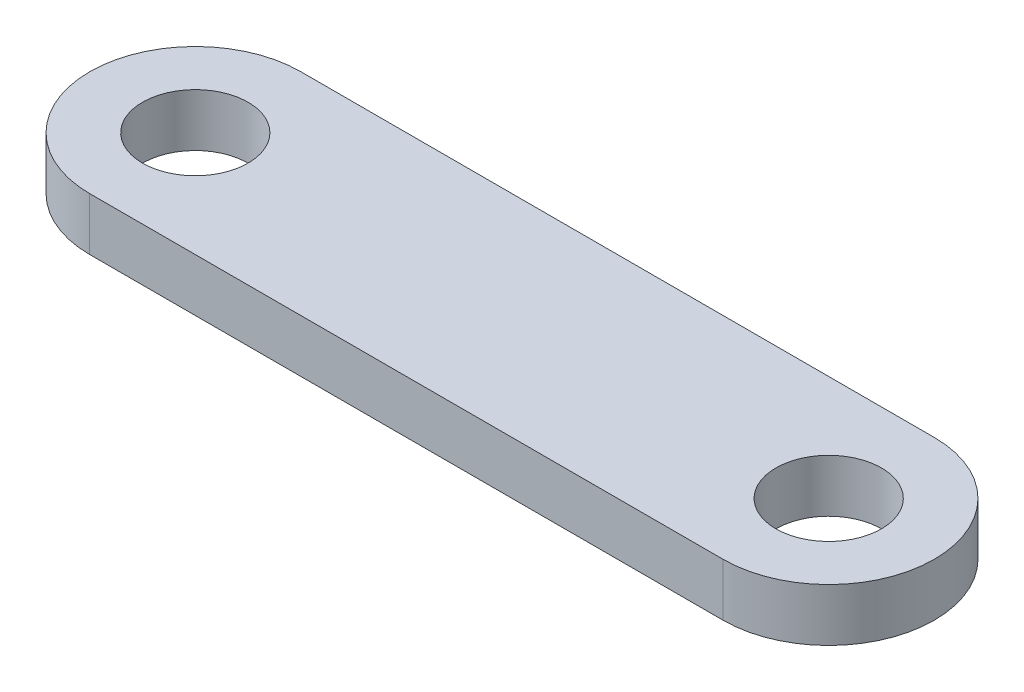
ISO-10303-21;
HEADER;
FILE_DESCRIPTION(('STEP AP214'),'2;1');
FILE_NAME('part.step','',(''),(''),'','','');
FILE_SCHEMA(('AUTOMOTIVE_DESIGN { 1 0 10303 214 1 1 1 1 }'));
ENDSEC;
DATA;
#1=APPLICATION_CONTEXT('core data for automotive mechanical design processes');
#2=APPLICATION_PROTOCOL_DEFINITION('international standard','automotive_design',2000,#1);
#3=PRODUCT_CONTEXT('',#1,'mechanical');
#4=PRODUCT('Part','Part','',(#3));
#5=PRODUCT_RELATED_PRODUCT_CATEGORY('part','',(#4));
#6=PRODUCT_DEFINITION_FORMATION('','',#4);
#7=PRODUCT_DEFINITION_CONTEXT('part definition',#1,'design');
#8=PRODUCT_DEFINITION('design','',#6,#7);
#9=PRODUCT_DEFINITION_SHAPE('','',#8);
#10=(LENGTH_UNIT() NAMED_UNIT(*) SI_UNIT(.MILLI.,.METRE.));
#11=(NAMED_UNIT(*) PLANE_ANGLE_UNIT() SI_UNIT($,.RADIAN.));
#12=(NAMED_UNIT(*) SI_UNIT($,.STERADIAN.) SOLID_ANGLE_UNIT());
#13=UNCERTAINTY_MEASURE_WITH_UNIT(LENGTH_MEASURE(1.E-05),#10,'distance_accuracy_value','');
#14=(GEOMETRIC_REPRESENTATION_CONTEXT(3) GLOBAL_UNCERTAINTY_ASSIGNED_CONTEXT((#13)) GLOBAL_UNIT_ASSIGNED_CONTEXT((#10,
#11,#12)) REPRESENTATION_CONTEXT('',''));
#15=CARTESIAN_POINT('',(0.,0.,0.));
#16=DIRECTION('',(0.,0.,1.));
#17=DIRECTION('',(1.,0.,0.));
#18=AXIS2_PLACEMENT_3D('',#15,#16,#17);
#19=CARTESIAN_POINT('',(-72.3468097091892,5.,0.));
#20=DIRECTION('',(0.,1.,0.));
#21=DIRECTION('',(0.,0.,1.));
#22=AXIS2_PLACEMENT_3D('',#19,#20,#21);
#23=PLANE('',#22);
#24=CARTESIAN_POINT('',(-72.3468097091892,5.,0.));
#25=DIRECTION('',(0.,1.,0.));
#26=DIRECTION('',(0.,0.,1.));
#27=AXIS2_PLACEMENT_3D('',#24,#25,#26);
#28=CIRCLE('',#27,5.);
#29=CARTESIAN_POINT('',(-72.3468097091892,5.,5.));
#30=VERTEX_POINT('',#29);
#31=EDGE_CURVE('E116',#30,#30,#28,.T.);
#32=ORIENTED_EDGE('',*,*,#31,.F.);
#33=EDGE_LOOP('',(#32));
#34=FACE_BOUND('',#33,.T.);
#35=CARTESIAN_POINT('',(-72.3468097091892,5.,0.));
#36=DIRECTION('',(0.,1.,0.));
#37=DIRECTION('',(0.,0.,1.));
#38=AXIS2_PLACEMENT_3D('',#35,#36,#37);
#39=CIRCLE('',#38,10.);
#40=CARTESIAN_POINT('',(-72.3468097091892,5.,-10.));
#41=VERTEX_POINT('',#40);
#42=CARTESIAN_POINT('',(-72.3468097091892,5.,10.));
#43=VERTEX_POINT('',#42);
#44=EDGE_CURVE('E96',#41,#43,#39,.T.);
#45=ORIENTED_EDGE('',*,*,#44,.T.);
#46=DIRECTION('',(1.,0.,0.));
#47=VECTOR('',#46,1.);
#48=CARTESIAN_POINT('',(-72.3468097091892,5.,10.));
#49=LINE('',#48,#47);
#50=CARTESIAN_POINT('',(-12.3468097091892,5.,10.));
#51=VERTEX_POINT('',#50);
#52=EDGE_CURVE('E91',#43,#51,#49,.T.);
#53=ORIENTED_EDGE('',*,*,#52,.T.);
#54=CARTESIAN_POINT('',(-12.3468097091892,5.,0.));
#55=DIRECTION('',(0.,1.,0.));
#56=DIRECTION('',(0.,0.,1.));
#57=AXIS2_PLACEMENT_3D('',#54,#55,#56);
#58=CIRCLE('',#57,10.);
#59=CARTESIAN_POINT('',(-12.3468097091892,5.,-10.));
#60=VERTEX_POINT('',#59);
#61=EDGE_CURVE('E94',#51,#60,#58,.T.);
#62=ORIENTED_EDGE('',*,*,#61,.T.);
#63=DIRECTION('',(-1.,0.,0.));
#64=VECTOR('',#63,1.);
#65=CARTESIAN_POINT('',(-72.3468097091892,5.,-10.));
#66=LINE('',#65,#64);
#67=EDGE_CURVE('E61',#60,#41,#66,.T.);
#68=ORIENTED_EDGE('',*,*,#67,.T.);
#69=EDGE_LOOP('',(#45,#53,#62,#68));
#70=FACE_BOUND('',#69,.T.);
#71=CARTESIAN_POINT('',(-12.3468097091892,5.,0.));
#72=DIRECTION('',(0.,1.,0.));
#73=DIRECTION('',(0.,0.,1.));
#74=AXIS2_PLACEMENT_3D('',#71,#72,#73);
#75=CIRCLE('',#74,5.);
#76=CARTESIAN_POINT('',(-12.3468097091892,5.,5.));
#77=VERTEX_POINT('',#76);
#78=EDGE_CURVE('E138',#77,#77,#75,.T.);
#79=ORIENTED_EDGE('',*,*,#78,.F.);
#80=EDGE_LOOP('',(#79));
#81=FACE_BOUND('',#80,.T.);
#82=ADVANCED_FACE('F43',(#34,#70,#81),#23,.T.);
#83=CARTESIAN_POINT('',(-72.3468097091892,0.,0.));
#84=DIRECTION('',(0.,1.,0.));
#85=DIRECTION('',(0.,0.,1.));
#86=AXIS2_PLACEMENT_3D('',#83,#84,#85);
#87=PLANE('',#86);
#88=CARTESIAN_POINT('',(-72.3468097091892,0.,0.));
#89=DIRECTION('',(0.,1.,0.));
#90=DIRECTION('',(0.,0.,1.));
#91=AXIS2_PLACEMENT_3D('',#88,#89,#90);
#92=CIRCLE('',#91,10.);
#93=CARTESIAN_POINT('',(-72.3468097091892,0.,-10.));
#94=VERTEX_POINT('',#93);
#95=CARTESIAN_POINT('',(-72.3468097091892,0.,10.));
#96=VERTEX_POINT('',#95);
#97=EDGE_CURVE('E112',#94,#96,#92,.T.);
#98=ORIENTED_EDGE('',*,*,#97,.F.);
#99=DIRECTION('',(-1.,0.,0.));
#100=VECTOR('',#99,1.);
#101=CARTESIAN_POINT('',(-72.3468097091892,0.,-10.));
#102=LINE('',#101,#100);
#103=CARTESIAN_POINT('',(-12.3468097091892,0.,-10.));
#104=VERTEX_POINT('',#103);
#105=EDGE_CURVE('E84',#104,#94,#102,.T.);
#106=ORIENTED_EDGE('',*,*,#105,.F.);
#107=CARTESIAN_POINT('',(-12.3468097091892,0.,0.));
#108=DIRECTION('',(0.,1.,0.));
#109=DIRECTION('',(0.,0.,1.));
#110=AXIS2_PLACEMENT_3D('',#107,#108,#109);
#111=CIRCLE('',#110,10.);
#112=CARTESIAN_POINT('',(-12.3468097091892,0.,10.));
#113=VERTEX_POINT('',#112);
#114=EDGE_CURVE('E78',#113,#104,#111,.T.);
#115=ORIENTED_EDGE('',*,*,#114,.F.);
#116=DIRECTION('',(1.,0.,0.));
#117=VECTOR('',#116,1.);
#118=CARTESIAN_POINT('',(-72.3468097091892,0.,10.));
#119=LINE('',#118,#117);
#120=EDGE_CURVE('E101',#96,#113,#119,.T.);
#121=ORIENTED_EDGE('',*,*,#120,.F.);
#122=EDGE_LOOP('',(#98,#106,#115,#121));
#123=FACE_BOUND('',#122,.T.);
#124=CARTESIAN_POINT('',(-72.3468097091892,0.,0.));
#125=DIRECTION('',(0.,1.,0.));
#126=DIRECTION('',(0.,0.,1.));
#127=AXIS2_PLACEMENT_3D('',#124,#125,#126);
#128=CIRCLE('',#127,5.);
#129=CARTESIAN_POINT('',(-72.3468097091892,0.,5.));
#130=VERTEX_POINT('',#129);
#131=EDGE_CURVE('E134',#130,#130,#128,.T.);
#132=ORIENTED_EDGE('',*,*,#131,.T.);
#133=EDGE_LOOP('',(#132));
#134=FACE_BOUND('',#133,.T.);
#135=CARTESIAN_POINT('',(-12.3468097091892,0.,0.));
#136=DIRECTION('',(0.,1.,0.));
#137=DIRECTION('',(0.,0.,1.));
#138=AXIS2_PLACEMENT_3D('',#135,#136,#137);
#139=CIRCLE('',#138,5.);
#140=CARTESIAN_POINT('',(-12.3468097091892,0.,5.));
#141=VERTEX_POINT('',#140);
#142=EDGE_CURVE('E142',#141,#141,#139,.T.);
#143=ORIENTED_EDGE('',*,*,#142,.T.);
#144=EDGE_LOOP('',(#143));
#145=FACE_BOUND('',#144,.T.);
#146=ADVANCED_FACE('F129',(#123,#134,#145),#87,.F.);
#147=CARTESIAN_POINT('',(-72.3468097091892,5.,0.));
#148=DIRECTION('',(0.,-1.,0.));
#149=DIRECTION('',(0.,0.,-1.));
#150=AXIS2_PLACEMENT_3D('',#147,#148,#149);
#151=CYLINDRICAL_SURFACE('',#150,10.);
#152=ORIENTED_EDGE('',*,*,#97,.T.);
#153=DIRECTION('',(0.,-1.,0.));
#154=VECTOR('',#153,1.);
#155=CARTESIAN_POINT('',(-72.3468097091892,5.,10.));
#156=LINE('',#155,#154);
#157=EDGE_CURVE('E11',#43,#96,#156,.T.);
#158=ORIENTED_EDGE('',*,*,#157,.F.);
#159=ORIENTED_EDGE('',*,*,#44,.F.);
#160=DIRECTION('',(0.,-1.,0.));
#161=VECTOR('',#160,1.);
#162=CARTESIAN_POINT('',(-72.3468097091892,5.,-10.));
#163=LINE('',#162,#161);
#164=EDGE_CURVE('E108',#41,#94,#163,.T.);
#165=ORIENTED_EDGE('',*,*,#164,.T.);
#166=EDGE_LOOP('',(#152,#158,#159,#165));
#167=FACE_BOUND('',#166,.T.);
#168=ADVANCED_FACE('F45',(#167),#151,.T.);
#169=CARTESIAN_POINT('',(-72.3468097091892,5.,10.));
#170=DIRECTION('',(0.,0.,-1.));
#171=DIRECTION('',(-1.,0.,0.));
#172=AXIS2_PLACEMENT_3D('',#169,#170,#171);
#173=PLANE('',#172);
#174=ORIENTED_EDGE('',*,*,#120,.T.);
#175=DIRECTION('',(0.,-1.,0.));
#176=VECTOR('',#175,1.);
#177=CARTESIAN_POINT('',(-12.3468097091892,5.,10.));
#178=LINE('',#177,#176);
#179=EDGE_CURVE('E53',#51,#113,#178,.T.);
#180=ORIENTED_EDGE('',*,*,#179,.F.);
#181=ORIENTED_EDGE('',*,*,#52,.F.);
#182=ORIENTED_EDGE('',*,*,#157,.T.);
#183=EDGE_LOOP('',(#174,#180,#181,#182));
#184=FACE_BOUND('',#183,.T.);
#185=ADVANCED_FACE('F100',(#184),#173,.F.);
#186=CARTESIAN_POINT('',(-12.3468097091892,5.,0.));
#187=DIRECTION('',(0.,-1.,0.));
#188=DIRECTION('',(0.,0.,-1.));
#189=AXIS2_PLACEMENT_3D('',#186,#187,#188);
#190=CYLINDRICAL_SURFACE('',#189,10.);
#191=ORIENTED_EDGE('',*,*,#114,.T.);
#192=DIRECTION('',(0.,-1.,0.));
#193=VECTOR('',#192,1.);
#194=CARTESIAN_POINT('',(-12.3468097091892,5.,-10.));
#195=LINE('',#194,#193);
#196=EDGE_CURVE('E103',#60,#104,#195,.T.);
#197=ORIENTED_EDGE('',*,*,#196,.F.);
#198=ORIENTED_EDGE('',*,*,#61,.F.);
#199=ORIENTED_EDGE('',*,*,#179,.T.);
#200=EDGE_LOOP('',(#191,#197,#198,#199));
#201=FACE_BOUND('',#200,.T.);
#202=ADVANCED_FACE('F104',(#201),#190,.T.);
#203=CARTESIAN_POINT('',(-72.3468097091892,5.,-10.));
#204=DIRECTION('',(0.,0.,1.));
#205=DIRECTION('',(1.,0.,0.));
#206=AXIS2_PLACEMENT_3D('',#203,#204,#205);
#207=PLANE('',#206);
#208=ORIENTED_EDGE('',*,*,#105,.T.);
#209=ORIENTED_EDGE('',*,*,#164,.F.);
#210=ORIENTED_EDGE('',*,*,#67,.F.);
#211=ORIENTED_EDGE('',*,*,#196,.T.);
#212=EDGE_LOOP('',(#208,#209,#210,#211));
#213=FACE_BOUND('',#212,.T.);
#214=ADVANCED_FACE('F126',(#213),#207,.F.);
#215=CARTESIAN_POINT('',(-72.3468097091892,5.,0.));
#216=DIRECTION('',(0.,-1.,0.));
#217=DIRECTION('',(0.,0.,-1.));
#218=AXIS2_PLACEMENT_3D('',#215,#216,#217);
#219=CYLINDRICAL_SURFACE('',#218,5.);
#220=ORIENTED_EDGE('',*,*,#31,.T.);
#221=EDGE_LOOP('',(#220));
#222=FACE_BOUND('',#221,.T.);
#223=ORIENTED_EDGE('',*,*,#131,.F.);
#224=EDGE_LOOP('',(#223));
#225=FACE_BOUND('',#224,.T.);
#226=ADVANCED_FACE('F161',(#222,#225),#219,.F.);
#227=CARTESIAN_POINT('',(-12.3468097091892,5.,0.));
#228=DIRECTION('',(0.,-1.,0.));
#229=DIRECTION('',(0.,0.,-1.));
#230=AXIS2_PLACEMENT_3D('',#227,#228,#229);
#231=CYLINDRICAL_SURFACE('',#230,5.);
#232=ORIENTED_EDGE('',*,*,#78,.T.);
#233=EDGE_LOOP('',(#232));
#234=FACE_BOUND('',#233,.T.);
#235=ORIENTED_EDGE('',*,*,#142,.F.);
#236=EDGE_LOOP('',(#235));
#237=FACE_BOUND('',#236,.T.);
#238=ADVANCED_FACE('F150',(#234,#237),#231,.F.);
#239=CLOSED_SHELL('',(#82,#146,#168,#185,#202,#214,#226,#238));
#240=MANIFOLD_SOLID_BREP('B2',#239);
#241=ADVANCED_BREP_SHAPE_REPRESENTATION('',(#18,#240),#14);
#242=SHAPE_DEFINITION_REPRESENTATION(#9,#241);
ENDSEC;
END-ISO-10303-21;
